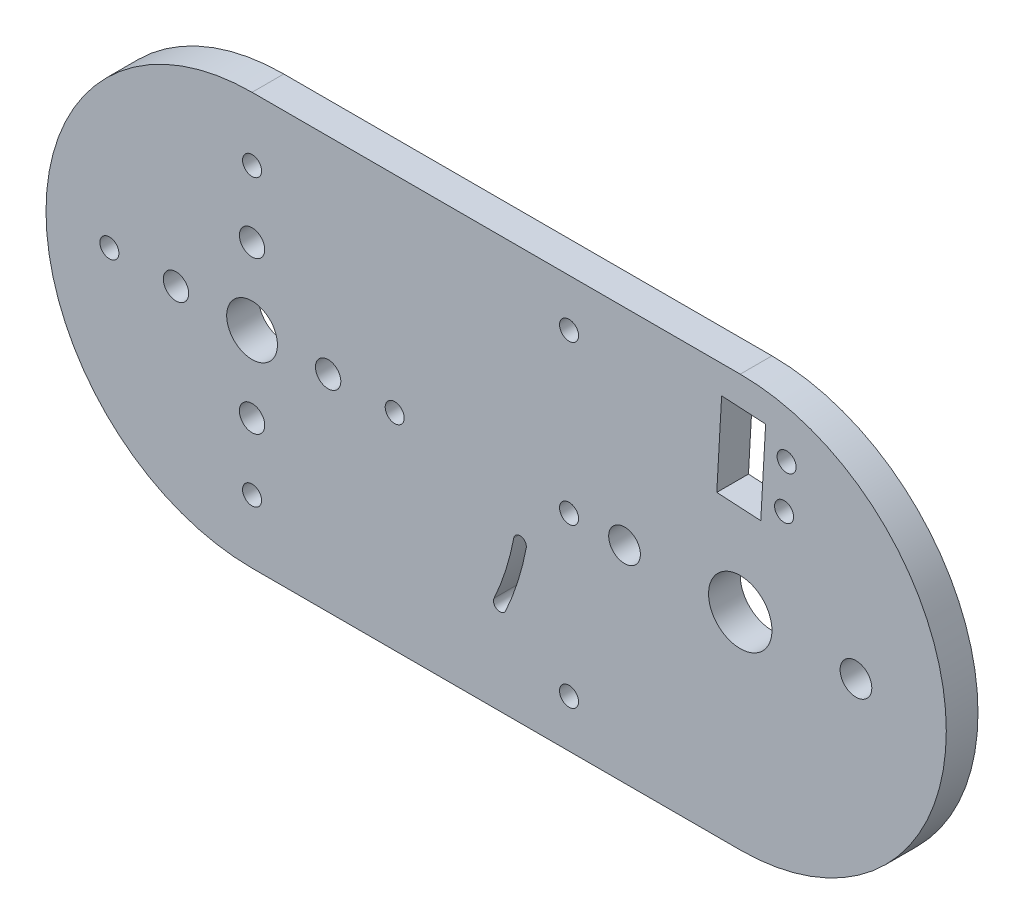
ISO-10303-21;
HEADER;
FILE_DESCRIPTION(('STEP AP214'),'2;1');
FILE_NAME('part.step','',(''),(''),'','','');
FILE_SCHEMA(('AUTOMOTIVE_DESIGN { 1 0 10303 214 1 1 1 1 }'));
ENDSEC;
DATA;
#1=APPLICATION_CONTEXT('core data for automotive mechanical design processes');
#2=APPLICATION_PROTOCOL_DEFINITION('international standard','automotive_design',2000,#1);
#3=PRODUCT_CONTEXT('',#1,'mechanical');
#4=PRODUCT('Part','Part','',(#3));
#5=PRODUCT_RELATED_PRODUCT_CATEGORY('part','',(#4));
#6=PRODUCT_DEFINITION_FORMATION('','',#4);
#7=PRODUCT_DEFINITION_CONTEXT('part definition',#1,'design');
#8=PRODUCT_DEFINITION('design','',#6,#7);
#9=PRODUCT_DEFINITION_SHAPE('','',#8);
#10=(LENGTH_UNIT() NAMED_UNIT(*) SI_UNIT(.MILLI.,.METRE.));
#11=(NAMED_UNIT(*) PLANE_ANGLE_UNIT() SI_UNIT($,.RADIAN.));
#12=(NAMED_UNIT(*) SI_UNIT($,.STERADIAN.) SOLID_ANGLE_UNIT());
#13=UNCERTAINTY_MEASURE_WITH_UNIT(LENGTH_MEASURE(1.E-05),#10,'distance_accuracy_value','');
#14=(GEOMETRIC_REPRESENTATION_CONTEXT(3) GLOBAL_UNCERTAINTY_ASSIGNED_CONTEXT((#13)) GLOBAL_UNIT_ASSIGNED_CONTEXT((#10,
#11,#12)) REPRESENTATION_CONTEXT('',''));
#15=CARTESIAN_POINT('',(0.,0.,0.));
#16=DIRECTION('',(0.,0.,1.));
#17=DIRECTION('',(1.,0.,0.));
#18=AXIS2_PLACEMENT_3D('',#15,#16,#17);
#19=CARTESIAN_POINT('',(-38.5,0.,5.));
#20=DIRECTION('',(0.,0.,1.));
#21=DIRECTION('',(1.,0.,0.));
#22=AXIS2_PLACEMENT_3D('',#19,#20,#21);
#23=PLANE('',#22);
#24=CARTESIAN_POINT('',(45.8113284801991,24.1895544692092,5.));
#25=DIRECTION('',(0.,0.,1.));
#26=DIRECTION('',(1.,0.,0.));
#27=AXIS2_PLACEMENT_3D('',#24,#25,#26);
#28=CIRCLE('',#27,1.5);
#29=CARTESIAN_POINT('',(47.3113284801991,24.1895544692092,5.));
#30=VERTEX_POINT('',#29);
#31=EDGE_CURVE('E195',#30,#30,#28,.T.);
#32=ORIENTED_EDGE('',*,*,#31,.F.);
#33=EDGE_LOOP('',(#32));
#34=FACE_BOUND('',#33,.T.);
#35=CARTESIAN_POINT('',(11.5,-25.,5.));
#36=DIRECTION('',(0.,0.,1.));
#37=DIRECTION('',(1.,0.,0.));
#38=AXIS2_PLACEMENT_3D('',#35,#36,#37);
#39=CIRCLE('',#38,1.5);
#40=CARTESIAN_POINT('',(13.,-25.,5.));
#41=VERTEX_POINT('',#40);
#42=EDGE_CURVE('E207',#41,#41,#39,.T.);
#43=ORIENTED_EDGE('',*,*,#42,.F.);
#44=EDGE_LOOP('',(#43));
#45=FACE_BOUND('',#44,.T.);
#46=CARTESIAN_POINT('',(-61.,0.,5.));
#47=DIRECTION('',(0.,0.,1.));
#48=DIRECTION('',(1.,0.,0.));
#49=AXIS2_PLACEMENT_3D('',#46,#47,#48);
#50=CIRCLE('',#49,1.5);
#51=CARTESIAN_POINT('',(-59.5,0.,5.));
#52=VERTEX_POINT('',#51);
#53=EDGE_CURVE('E219',#52,#52,#50,.T.);
#54=ORIENTED_EDGE('',*,*,#53,.F.);
#55=EDGE_LOOP('',(#54));
#56=FACE_BOUND('',#55,.T.);
#57=CARTESIAN_POINT('',(-16.,0.,5.));
#58=DIRECTION('',(0.,0.,1.));
#59=DIRECTION('',(1.,0.,0.));
#60=AXIS2_PLACEMENT_3D('',#57,#58,#59);
#61=CIRCLE('',#60,1.5);
#62=CARTESIAN_POINT('',(-14.5,0.,5.));
#63=VERTEX_POINT('',#62);
#64=EDGE_CURVE('E231',#63,#63,#61,.T.);
#65=ORIENTED_EDGE('',*,*,#64,.F.);
#66=EDGE_LOOP('',(#65));
#67=FACE_BOUND('',#66,.T.);
#68=CARTESIAN_POINT('',(-50.5,0.,5.));
#69=DIRECTION('',(0.,0.,1.));
#70=DIRECTION('',(1.,0.,0.));
#71=AXIS2_PLACEMENT_3D('',#68,#69,#70);
#72=CIRCLE('',#71,2.);
#73=CARTESIAN_POINT('',(-48.5,0.,5.));
#74=VERTEX_POINT('',#73);
#75=EDGE_CURVE('E243',#74,#74,#72,.T.);
#76=ORIENTED_EDGE('',*,*,#75,.F.);
#77=EDGE_LOOP('',(#76));
#78=FACE_BOUND('',#77,.T.);
#79=CARTESIAN_POINT('',(-26.5,0.,5.));
#80=DIRECTION('',(0.,0.,1.));
#81=DIRECTION('',(1.,0.,0.));
#82=AXIS2_PLACEMENT_3D('',#79,#80,#81);
#83=CIRCLE('',#82,2.);
#84=CARTESIAN_POINT('',(-24.5,0.,5.));
#85=VERTEX_POINT('',#84);
#86=EDGE_CURVE('E255',#85,#85,#83,.T.);
#87=ORIENTED_EDGE('',*,*,#86,.F.);
#88=EDGE_LOOP('',(#87));
#89=FACE_BOUND('',#88,.T.);
#90=CARTESIAN_POINT('',(56.75,0.,5.));
#91=DIRECTION('',(0.,0.,1.));
#92=DIRECTION('',(1.,0.,0.));
#93=AXIS2_PLACEMENT_3D('',#90,#91,#92);
#94=CIRCLE('',#93,2.5);
#95=CARTESIAN_POINT('',(59.25,0.,5.));
#96=VERTEX_POINT('',#95);
#97=EDGE_CURVE('E267',#96,#96,#94,.T.);
#98=ORIENTED_EDGE('',*,*,#97,.F.);
#99=EDGE_LOOP('',(#98));
#100=FACE_BOUND('',#99,.T.);
#101=CARTESIAN_POINT('',(38.5,0.,5.));
#102=DIRECTION('',(0.,0.,1.));
#103=DIRECTION('',(1.,0.,0.));
#104=AXIS2_PLACEMENT_3D('',#101,#102,#103);
#105=CIRCLE('',#104,5.);
#106=CARTESIAN_POINT('',(43.5,0.,5.));
#107=VERTEX_POINT('',#106);
#108=EDGE_CURVE('E279',#107,#107,#105,.T.);
#109=ORIENTED_EDGE('',*,*,#108,.F.);
#110=EDGE_LOOP('',(#109));
#111=FACE_BOUND('',#110,.T.);
#112=CARTESIAN_POINT('',(-38.5,0.,5.));
#113=DIRECTION('',(0.,0.,1.));
#114=DIRECTION('',(1.,0.,0.));
#115=AXIS2_PLACEMENT_3D('',#112,#113,#114);
#116=CIRCLE('',#115,32.5);
#117=CARTESIAN_POINT('',(-38.5,32.5,5.));
#118=VERTEX_POINT('',#117);
#119=CARTESIAN_POINT('',(-38.5,-32.5,5.));
#120=VERTEX_POINT('',#119);
#121=EDGE_CURVE('E291',#118,#120,#116,.T.);
#122=ORIENTED_EDGE('',*,*,#121,.T.);
#123=DIRECTION('',(1.,0.,0.));
#124=VECTOR('',#123,1.);
#125=CARTESIAN_POINT('',(-38.5,-32.5,5.));
#126=LINE('',#125,#124);
#127=CARTESIAN_POINT('',(38.5,-32.5,5.));
#128=VERTEX_POINT('',#127);
#129=EDGE_CURVE('E294',#120,#128,#126,.T.);
#130=ORIENTED_EDGE('',*,*,#129,.T.);
#131=CARTESIAN_POINT('',(38.5,0.,5.));
#132=DIRECTION('',(0.,0.,1.));
#133=DIRECTION('',(1.,0.,0.));
#134=AXIS2_PLACEMENT_3D('',#131,#132,#133);
#135=CIRCLE('',#134,32.5);
#136=CARTESIAN_POINT('',(38.5,32.5,5.));
#137=VERTEX_POINT('',#136);
#138=EDGE_CURVE('E297',#128,#137,#135,.T.);
#139=ORIENTED_EDGE('',*,*,#138,.T.);
#140=DIRECTION('',(-1.,0.,0.));
#141=VECTOR('',#140,1.);
#142=CARTESIAN_POINT('',(-38.5,32.5,5.));
#143=LINE('',#142,#141);
#144=EDGE_CURVE('E299',#137,#118,#143,.T.);
#145=ORIENTED_EDGE('',*,*,#144,.T.);
#146=EDGE_LOOP('',(#122,#130,#139,#145));
#147=FACE_BOUND('',#146,.T.);
#148=CARTESIAN_POINT('',(-38.5,0.,5.));
#149=DIRECTION('',(0.,0.,1.));
#150=DIRECTION('',(1.,0.,0.));
#151=AXIS2_PLACEMENT_3D('',#148,#149,#150);
#152=CIRCLE('',#151,4.);
#153=CARTESIAN_POINT('',(-34.5,0.,5.));
#154=VERTEX_POINT('',#153);
#155=EDGE_CURVE('E285',#154,#154,#152,.T.);
#156=ORIENTED_EDGE('',*,*,#155,.F.);
#157=EDGE_LOOP('',(#156));
#158=FACE_BOUND('',#157,.T.);
#159=CARTESIAN_POINT('',(20.25,0.,5.));
#160=DIRECTION('',(0.,0.,1.));
#161=DIRECTION('',(1.,0.,0.));
#162=AXIS2_PLACEMENT_3D('',#159,#160,#161);
#163=CIRCLE('',#162,2.5);
#164=CARTESIAN_POINT('',(22.75,0.,5.));
#165=VERTEX_POINT('',#164);
#166=EDGE_CURVE('E273',#165,#165,#163,.T.);
#167=ORIENTED_EDGE('',*,*,#166,.F.);
#168=EDGE_LOOP('',(#167));
#169=FACE_BOUND('',#168,.T.);
#170=CARTESIAN_POINT('',(-38.5,-12.,5.));
#171=DIRECTION('',(0.,0.,1.));
#172=DIRECTION('',(1.,0.,0.));
#173=AXIS2_PLACEMENT_3D('',#170,#171,#172);
#174=CIRCLE('',#173,2.);
#175=CARTESIAN_POINT('',(-36.5,-12.,5.));
#176=VERTEX_POINT('',#175);
#177=EDGE_CURVE('E261',#176,#176,#174,.T.);
#178=ORIENTED_EDGE('',*,*,#177,.F.);
#179=EDGE_LOOP('',(#178));
#180=FACE_BOUND('',#179,.T.);
#181=CARTESIAN_POINT('',(-38.5,12.,5.));
#182=DIRECTION('',(0.,0.,1.));
#183=DIRECTION('',(1.,0.,0.));
#184=AXIS2_PLACEMENT_3D('',#181,#182,#183);
#185=CIRCLE('',#184,2.);
#186=CARTESIAN_POINT('',(-36.5,12.,5.));
#187=VERTEX_POINT('',#186);
#188=EDGE_CURVE('E249',#187,#187,#185,.T.);
#189=ORIENTED_EDGE('',*,*,#188,.F.);
#190=EDGE_LOOP('',(#189));
#191=FACE_BOUND('',#190,.T.);
#192=CARTESIAN_POINT('',(-38.5,22.5,5.));
#193=DIRECTION('',(0.,0.,1.));
#194=DIRECTION('',(1.,0.,0.));
#195=AXIS2_PLACEMENT_3D('',#192,#193,#194);
#196=CIRCLE('',#195,1.5);
#197=CARTESIAN_POINT('',(-37.,22.5,5.));
#198=VERTEX_POINT('',#197);
#199=EDGE_CURVE('E237',#198,#198,#196,.T.);
#200=ORIENTED_EDGE('',*,*,#199,.F.);
#201=EDGE_LOOP('',(#200));
#202=FACE_BOUND('',#201,.T.);
#203=CARTESIAN_POINT('',(-38.5,-22.5,5.));
#204=DIRECTION('',(0.,0.,1.));
#205=DIRECTION('',(1.,0.,0.));
#206=AXIS2_PLACEMENT_3D('',#203,#204,#205);
#207=CIRCLE('',#206,1.5);
#208=CARTESIAN_POINT('',(-37.,-22.5,5.));
#209=VERTEX_POINT('',#208);
#210=EDGE_CURVE('E225',#209,#209,#207,.T.);
#211=ORIENTED_EDGE('',*,*,#210,.F.);
#212=EDGE_LOOP('',(#211));
#213=FACE_BOUND('',#212,.T.);
#214=CARTESIAN_POINT('',(11.5,0.,5.));
#215=DIRECTION('',(0.,0.,1.));
#216=DIRECTION('',(1.,0.,0.));
#217=AXIS2_PLACEMENT_3D('',#214,#215,#216);
#218=CIRCLE('',#217,1.5);
#219=CARTESIAN_POINT('',(13.,0.,5.));
#220=VERTEX_POINT('',#219);
#221=EDGE_CURVE('E213',#220,#220,#218,.T.);
#222=ORIENTED_EDGE('',*,*,#221,.F.);
#223=EDGE_LOOP('',(#222));
#224=FACE_BOUND('',#223,.T.);
#225=CARTESIAN_POINT('',(11.5,25.,5.));
#226=DIRECTION('',(0.,0.,1.));
#227=DIRECTION('',(1.,0.,0.));
#228=AXIS2_PLACEMENT_3D('',#225,#226,#227);
#229=CIRCLE('',#228,1.5);
#230=CARTESIAN_POINT('',(13.,25.,5.));
#231=VERTEX_POINT('',#230);
#232=EDGE_CURVE('E201',#231,#231,#229,.T.);
#233=ORIENTED_EDGE('',*,*,#232,.F.);
#234=EDGE_LOOP('',(#233));
#235=FACE_BOUND('',#234,.T.);
#236=CARTESIAN_POINT('',(45.4163894157242,17.2007045534027,5.));
#237=DIRECTION('',(0.,0.,1.));
#238=DIRECTION('',(1.,0.,0.));
#239=AXIS2_PLACEMENT_3D('',#236,#237,#238);
#240=CIRCLE('',#239,1.49999999999999);
#241=CARTESIAN_POINT('',(46.9163894157242,17.2007045534027,5.));
#242=VERTEX_POINT('',#241);
#243=EDGE_CURVE('E189',#242,#242,#240,.T.);
#244=ORIENTED_EDGE('',*,*,#243,.F.);
#245=EDGE_LOOP('',(#244));
#246=FACE_BOUND('',#245,.T.);
#247=CARTESIAN_POINT('',(0.588763908782562,-17.9183854206638,5.));
#248=DIRECTION('',(0.,0.,1.));
#249=DIRECTION('',(1.,0.,0.));
#250=AXIS2_PLACEMENT_3D('',#247,#248,#249);
#251=CIRCLE('',#250,1.);
#252=CARTESIAN_POINT('',(-0.320277112354612,-17.5016787829798,5.));
#253=VERTEX_POINT('',#252);
#254=CARTESIAN_POINT('',(1.49780492991973,-18.3350920583478,5.));
#255=VERTEX_POINT('',#254);
#256=EDGE_CURVE('E160',#253,#255,#251,.T.);
#257=ORIENTED_EDGE('',*,*,#256,.F.);
#258=CARTESIAN_POINT('',(-38.5,0.,5.));
#259=DIRECTION('',(0.,0.,-1.));
#260=DIRECTION('',(1.,0.,0.));
#261=AXIS2_PLACEMENT_3D('',#258,#259,#260);
#262=CIRCLE('',#261,42.);
#263=CARTESIAN_POINT('',(2.78021392533827,-7.74234707813517,5.));
#264=VERTEX_POINT('',#263);
#265=EDGE_CURVE('E158',#264,#253,#262,.T.);
#266=ORIENTED_EDGE('',*,*,#265,.F.);
#267=CARTESIAN_POINT('',(3.76307616165431,-7.92668867524178,5.));
#268=DIRECTION('',(0.,0.,1.));
#269=DIRECTION('',(-1.,0.,0.));
#270=AXIS2_PLACEMENT_3D('',#267,#268,#269);
#271=CIRCLE('',#270,0.999999999999996);
#272=CARTESIAN_POINT('',(4.74593839797185,-8.11103027234043,5.));
#273=VERTEX_POINT('',#272);
#274=EDGE_CURVE('E166',#273,#264,#271,.T.);
#275=ORIENTED_EDGE('',*,*,#274,.F.);
#276=CARTESIAN_POINT('',(-38.5,0.,5.));
#277=DIRECTION('',(0.,0.,1.));
#278=DIRECTION('',(1.,0.,0.));
#279=AXIS2_PLACEMENT_3D('',#276,#277,#278);
#280=CIRCLE('',#279,44.);
#281=EDGE_CURVE('E163',#255,#273,#280,.T.);
#282=ORIENTED_EDGE('',*,*,#281,.F.);
#283=EDGE_LOOP('',(#257,#266,#275,#282));
#284=FACE_BOUND('',#283,.T.);
#285=DIRECTION('',(0.0564198663476302,0.998407130724393,0.));
#286=VECTOR('',#285,1.);
#287=CARTESIAN_POINT('',(42.5030890815902,27.6817675324485,5.));
#288=LINE('',#287,#286);
#289=CARTESIAN_POINT('',(41.7357788992624,14.1034305545968,5.));
#290=VERTEX_POINT('',#289);
#291=CARTESIAN_POINT('',(42.5030890815902,27.6817675324485,5.));
#292=VERTEX_POINT('',#291);
#293=EDGE_CURVE('E130',#290,#292,#288,.T.);
#294=ORIENTED_EDGE('',*,*,#293,.F.);
#295=DIRECTION('',(0.998407130724393,-0.05641986634763,0.));
#296=VECTOR('',#295,1.);
#297=CARTESIAN_POINT('',(34.7968493407279,14.4955486257128,5.));
#298=LINE('',#297,#296);
#299=CARTESIAN_POINT('',(34.7968493407279,14.4955486257128,5.));
#300=VERTEX_POINT('',#299);
#301=EDGE_CURVE('E122',#300,#290,#298,.T.);
#302=ORIENTED_EDGE('',*,*,#301,.F.);
#303=DIRECTION('',(-0.0564198663476302,-0.998407130724393,0.));
#304=VECTOR('',#303,1.);
#305=CARTESIAN_POINT('',(35.5641595230556,28.0738856035646,5.));
#306=LINE('',#305,#304);
#307=CARTESIAN_POINT('',(35.5641595230556,28.0738856035646,5.));
#308=VERTEX_POINT('',#307);
#309=EDGE_CURVE('E144',#308,#300,#306,.T.);
#310=ORIENTED_EDGE('',*,*,#309,.F.);
#311=DIRECTION('',(-0.998407130724393,0.0564198663476302,0.));
#312=VECTOR('',#311,1.);
#313=CARTESIAN_POINT('',(42.5030890815902,27.6817675324485,5.));
#314=LINE('',#313,#312);
#315=EDGE_CURVE('E142',#292,#308,#314,.T.);
#316=ORIENTED_EDGE('',*,*,#315,.F.);
#317=EDGE_LOOP('',(#294,#302,#310,#316));
#318=FACE_BOUND('',#317,.T.);
#319=ADVANCED_FACE('F33',(#34,#45,#56,#67,#78,#89,#100,#111,#147,#158,#169,#180,#191,#202,#213,
#224,#235,#246,#284,#318),#23,.T.);
#320=CARTESIAN_POINT('',(-38.5,0.,0.));
#321=DIRECTION('',(0.,0.,1.));
#322=DIRECTION('',(1.,0.,0.));
#323=AXIS2_PLACEMENT_3D('',#320,#321,#322);
#324=PLANE('',#323);
#325=CARTESIAN_POINT('',(-38.5,0.,0.));
#326=DIRECTION('',(0.,0.,-1.));
#327=DIRECTION('',(1.,0.,0.));
#328=AXIS2_PLACEMENT_3D('',#325,#326,#327);
#329=CIRCLE('',#328,42.);
#330=CARTESIAN_POINT('',(2.78021392533827,-7.74234707813517,0.));
#331=VERTEX_POINT('',#330);
#332=CARTESIAN_POINT('',(-0.320277112354612,-17.5016787829798,0.));
#333=VERTEX_POINT('',#332);
#334=EDGE_CURVE('E138',#331,#333,#329,.T.);
#335=ORIENTED_EDGE('',*,*,#334,.T.);
#336=CARTESIAN_POINT('',(0.588763908782562,-17.9183854206638,0.));
#337=DIRECTION('',(0.,0.,1.));
#338=DIRECTION('',(1.,0.,0.));
#339=AXIS2_PLACEMENT_3D('',#336,#337,#338);
#340=CIRCLE('',#339,1.);
#341=CARTESIAN_POINT('',(1.49780492991973,-18.3350920583478,0.));
#342=VERTEX_POINT('',#341);
#343=EDGE_CURVE('E171',#333,#342,#340,.T.);
#344=ORIENTED_EDGE('',*,*,#343,.T.);
#345=CARTESIAN_POINT('',(-38.5,0.,0.));
#346=DIRECTION('',(0.,0.,1.));
#347=DIRECTION('',(1.,0.,0.));
#348=AXIS2_PLACEMENT_3D('',#345,#346,#347);
#349=CIRCLE('',#348,44.);
#350=CARTESIAN_POINT('',(4.74593839797186,-8.11103027234043,0.));
#351=VERTEX_POINT('',#350);
#352=EDGE_CURVE('E174',#342,#351,#349,.T.);
#353=ORIENTED_EDGE('',*,*,#352,.T.);
#354=CARTESIAN_POINT('',(3.76307616165431,-7.92668867524178,0.));
#355=DIRECTION('',(0.,0.,1.));
#356=DIRECTION('',(-1.,0.,0.));
#357=AXIS2_PLACEMENT_3D('',#354,#355,#356);
#358=CIRCLE('',#357,0.999999999999996);
#359=EDGE_CURVE('E161',#351,#331,#358,.T.);
#360=ORIENTED_EDGE('',*,*,#359,.T.);
#361=EDGE_LOOP('',(#335,#344,#353,#360));
#362=FACE_BOUND('',#361,.T.);
#363=CARTESIAN_POINT('',(-38.5,0.,0.));
#364=DIRECTION('',(0.,0.,1.));
#365=DIRECTION('',(1.,0.,0.));
#366=AXIS2_PLACEMENT_3D('',#363,#364,#365);
#367=CIRCLE('',#366,32.5);
#368=CARTESIAN_POINT('',(-38.5,32.5,0.));
#369=VERTEX_POINT('',#368);
#370=CARTESIAN_POINT('',(-38.5,-32.5,0.));
#371=VERTEX_POINT('',#370);
#372=EDGE_CURVE('E288',#369,#371,#367,.T.);
#373=ORIENTED_EDGE('',*,*,#372,.F.);
#374=DIRECTION('',(-1.,0.,0.));
#375=VECTOR('',#374,1.);
#376=CARTESIAN_POINT('',(-38.5,32.5,0.));
#377=LINE('',#376,#375);
#378=CARTESIAN_POINT('',(38.5,32.5,0.));
#379=VERTEX_POINT('',#378);
#380=EDGE_CURVE('E295',#379,#369,#377,.T.);
#381=ORIENTED_EDGE('',*,*,#380,.F.);
#382=CARTESIAN_POINT('',(38.5,0.,0.));
#383=DIRECTION('',(0.,0.,1.));
#384=DIRECTION('',(1.,0.,0.));
#385=AXIS2_PLACEMENT_3D('',#382,#383,#384);
#386=CIRCLE('',#385,32.5);
#387=CARTESIAN_POINT('',(38.5,-32.5,0.));
#388=VERTEX_POINT('',#387);
#389=EDGE_CURVE('E306',#388,#379,#386,.T.);
#390=ORIENTED_EDGE('',*,*,#389,.F.);
#391=DIRECTION('',(1.,0.,0.));
#392=VECTOR('',#391,1.);
#393=CARTESIAN_POINT('',(-38.5,-32.5,0.));
#394=LINE('',#393,#392);
#395=EDGE_CURVE('E304',#371,#388,#394,.T.);
#396=ORIENTED_EDGE('',*,*,#395,.F.);
#397=EDGE_LOOP('',(#373,#381,#390,#396));
#398=FACE_BOUND('',#397,.T.);
#399=CARTESIAN_POINT('',(-38.5,0.,0.));
#400=DIRECTION('',(0.,0.,1.));
#401=DIRECTION('',(1.,0.,0.));
#402=AXIS2_PLACEMENT_3D('',#399,#400,#401);
#403=CIRCLE('',#402,4.);
#404=CARTESIAN_POINT('',(-34.5,0.,0.));
#405=VERTEX_POINT('',#404);
#406=EDGE_CURVE('E282',#405,#405,#403,.T.);
#407=ORIENTED_EDGE('',*,*,#406,.T.);
#408=EDGE_LOOP('',(#407));
#409=FACE_BOUND('',#408,.T.);
#410=CARTESIAN_POINT('',(38.5,0.,0.));
#411=DIRECTION('',(0.,0.,1.));
#412=DIRECTION('',(1.,0.,0.));
#413=AXIS2_PLACEMENT_3D('',#410,#411,#412);
#414=CIRCLE('',#413,5.);
#415=CARTESIAN_POINT('',(43.5,0.,0.));
#416=VERTEX_POINT('',#415);
#417=EDGE_CURVE('E276',#416,#416,#414,.T.);
#418=ORIENTED_EDGE('',*,*,#417,.T.);
#419=EDGE_LOOP('',(#418));
#420=FACE_BOUND('',#419,.T.);
#421=CARTESIAN_POINT('',(20.25,0.,0.));
#422=DIRECTION('',(0.,0.,1.));
#423=DIRECTION('',(1.,0.,0.));
#424=AXIS2_PLACEMENT_3D('',#421,#422,#423);
#425=CIRCLE('',#424,2.5);
#426=CARTESIAN_POINT('',(22.75,0.,0.));
#427=VERTEX_POINT('',#426);
#428=EDGE_CURVE('E270',#427,#427,#425,.T.);
#429=ORIENTED_EDGE('',*,*,#428,.T.);
#430=EDGE_LOOP('',(#429));
#431=FACE_BOUND('',#430,.T.);
#432=CARTESIAN_POINT('',(56.75,0.,0.));
#433=DIRECTION('',(0.,0.,1.));
#434=DIRECTION('',(1.,0.,0.));
#435=AXIS2_PLACEMENT_3D('',#432,#433,#434);
#436=CIRCLE('',#435,2.5);
#437=CARTESIAN_POINT('',(59.25,0.,0.));
#438=VERTEX_POINT('',#437);
#439=EDGE_CURVE('E264',#438,#438,#436,.T.);
#440=ORIENTED_EDGE('',*,*,#439,.T.);
#441=EDGE_LOOP('',(#440));
#442=FACE_BOUND('',#441,.T.);
#443=CARTESIAN_POINT('',(-38.5,-12.,0.));
#444=DIRECTION('',(0.,0.,1.));
#445=DIRECTION('',(1.,0.,0.));
#446=AXIS2_PLACEMENT_3D('',#443,#444,#445);
#447=CIRCLE('',#446,2.);
#448=CARTESIAN_POINT('',(-36.5,-12.,0.));
#449=VERTEX_POINT('',#448);
#450=EDGE_CURVE('E258',#449,#449,#447,.T.);
#451=ORIENTED_EDGE('',*,*,#450,.T.);
#452=EDGE_LOOP('',(#451));
#453=FACE_BOUND('',#452,.T.);
#454=CARTESIAN_POINT('',(-26.5,0.,0.));
#455=DIRECTION('',(0.,0.,1.));
#456=DIRECTION('',(1.,0.,0.));
#457=AXIS2_PLACEMENT_3D('',#454,#455,#456);
#458=CIRCLE('',#457,2.);
#459=CARTESIAN_POINT('',(-24.5,0.,0.));
#460=VERTEX_POINT('',#459);
#461=EDGE_CURVE('E252',#460,#460,#458,.T.);
#462=ORIENTED_EDGE('',*,*,#461,.T.);
#463=EDGE_LOOP('',(#462));
#464=FACE_BOUND('',#463,.T.);
#465=CARTESIAN_POINT('',(-38.5,12.,0.));
#466=DIRECTION('',(0.,0.,1.));
#467=DIRECTION('',(1.,0.,0.));
#468=AXIS2_PLACEMENT_3D('',#465,#466,#467);
#469=CIRCLE('',#468,2.);
#470=CARTESIAN_POINT('',(-36.5,12.,0.));
#471=VERTEX_POINT('',#470);
#472=EDGE_CURVE('E246',#471,#471,#469,.T.);
#473=ORIENTED_EDGE('',*,*,#472,.T.);
#474=EDGE_LOOP('',(#473));
#475=FACE_BOUND('',#474,.T.);
#476=CARTESIAN_POINT('',(-50.5,0.,0.));
#477=DIRECTION('',(0.,0.,1.));
#478=DIRECTION('',(1.,0.,0.));
#479=AXIS2_PLACEMENT_3D('',#476,#477,#478);
#480=CIRCLE('',#479,2.);
#481=CARTESIAN_POINT('',(-48.5,0.,0.));
#482=VERTEX_POINT('',#481);
#483=EDGE_CURVE('E240',#482,#482,#480,.T.);
#484=ORIENTED_EDGE('',*,*,#483,.T.);
#485=EDGE_LOOP('',(#484));
#486=FACE_BOUND('',#485,.T.);
#487=CARTESIAN_POINT('',(-38.5,22.5,0.));
#488=DIRECTION('',(0.,0.,1.));
#489=DIRECTION('',(1.,0.,0.));
#490=AXIS2_PLACEMENT_3D('',#487,#488,#489);
#491=CIRCLE('',#490,1.5);
#492=CARTESIAN_POINT('',(-37.,22.5,0.));
#493=VERTEX_POINT('',#492);
#494=EDGE_CURVE('E234',#493,#493,#491,.T.);
#495=ORIENTED_EDGE('',*,*,#494,.T.);
#496=EDGE_LOOP('',(#495));
#497=FACE_BOUND('',#496,.T.);
#498=CARTESIAN_POINT('',(-16.,0.,0.));
#499=DIRECTION('',(0.,0.,1.));
#500=DIRECTION('',(1.,0.,0.));
#501=AXIS2_PLACEMENT_3D('',#498,#499,#500);
#502=CIRCLE('',#501,1.5);
#503=CARTESIAN_POINT('',(-14.5,0.,0.));
#504=VERTEX_POINT('',#503);
#505=EDGE_CURVE('E228',#504,#504,#502,.T.);
#506=ORIENTED_EDGE('',*,*,#505,.T.);
#507=EDGE_LOOP('',(#506));
#508=FACE_BOUND('',#507,.T.);
#509=CARTESIAN_POINT('',(-38.5,-22.5,0.));
#510=DIRECTION('',(0.,0.,1.));
#511=DIRECTION('',(1.,0.,0.));
#512=AXIS2_PLACEMENT_3D('',#509,#510,#511);
#513=CIRCLE('',#512,1.5);
#514=CARTESIAN_POINT('',(-37.,-22.5,0.));
#515=VERTEX_POINT('',#514);
#516=EDGE_CURVE('E222',#515,#515,#513,.T.);
#517=ORIENTED_EDGE('',*,*,#516,.T.);
#518=EDGE_LOOP('',(#517));
#519=FACE_BOUND('',#518,.T.);
#520=CARTESIAN_POINT('',(-61.,0.,0.));
#521=DIRECTION('',(0.,0.,1.));
#522=DIRECTION('',(1.,0.,0.));
#523=AXIS2_PLACEMENT_3D('',#520,#521,#522);
#524=CIRCLE('',#523,1.5);
#525=CARTESIAN_POINT('',(-59.5,0.,0.));
#526=VERTEX_POINT('',#525);
#527=EDGE_CURVE('E216',#526,#526,#524,.T.);
#528=ORIENTED_EDGE('',*,*,#527,.T.);
#529=EDGE_LOOP('',(#528));
#530=FACE_BOUND('',#529,.T.);
#531=CARTESIAN_POINT('',(11.5,0.,0.));
#532=DIRECTION('',(0.,0.,1.));
#533=DIRECTION('',(1.,0.,0.));
#534=AXIS2_PLACEMENT_3D('',#531,#532,#533);
#535=CIRCLE('',#534,1.5);
#536=CARTESIAN_POINT('',(13.,0.,0.));
#537=VERTEX_POINT('',#536);
#538=EDGE_CURVE('E210',#537,#537,#535,.T.);
#539=ORIENTED_EDGE('',*,*,#538,.T.);
#540=EDGE_LOOP('',(#539));
#541=FACE_BOUND('',#540,.T.);
#542=CARTESIAN_POINT('',(11.5,-25.,0.));
#543=DIRECTION('',(0.,0.,1.));
#544=DIRECTION('',(1.,0.,0.));
#545=AXIS2_PLACEMENT_3D('',#542,#543,#544);
#546=CIRCLE('',#545,1.5);
#547=CARTESIAN_POINT('',(13.,-25.,0.));
#548=VERTEX_POINT('',#547);
#549=EDGE_CURVE('E204',#548,#548,#546,.T.);
#550=ORIENTED_EDGE('',*,*,#549,.T.);
#551=EDGE_LOOP('',(#550));
#552=FACE_BOUND('',#551,.T.);
#553=CARTESIAN_POINT('',(11.5,25.,0.));
#554=DIRECTION('',(0.,0.,1.));
#555=DIRECTION('',(1.,0.,0.));
#556=AXIS2_PLACEMENT_3D('',#553,#554,#555);
#557=CIRCLE('',#556,1.5);
#558=CARTESIAN_POINT('',(13.,25.,0.));
#559=VERTEX_POINT('',#558);
#560=EDGE_CURVE('E198',#559,#559,#557,.T.);
#561=ORIENTED_EDGE('',*,*,#560,.T.);
#562=EDGE_LOOP('',(#561));
#563=FACE_BOUND('',#562,.T.);
#564=CARTESIAN_POINT('',(45.8113284801991,24.1895544692092,0.));
#565=DIRECTION('',(0.,0.,1.));
#566=DIRECTION('',(1.,0.,0.));
#567=AXIS2_PLACEMENT_3D('',#564,#565,#566);
#568=CIRCLE('',#567,1.5);
#569=CARTESIAN_POINT('',(47.3113284801991,24.1895544692092,0.));
#570=VERTEX_POINT('',#569);
#571=EDGE_CURVE('E192',#570,#570,#568,.T.);
#572=ORIENTED_EDGE('',*,*,#571,.T.);
#573=EDGE_LOOP('',(#572));
#574=FACE_BOUND('',#573,.T.);
#575=CARTESIAN_POINT('',(45.4163894157242,17.2007045534027,0.));
#576=DIRECTION('',(0.,0.,1.));
#577=DIRECTION('',(1.,0.,0.));
#578=AXIS2_PLACEMENT_3D('',#575,#576,#577);
#579=CIRCLE('',#578,1.49999999999999);
#580=CARTESIAN_POINT('',(46.9163894157242,17.2007045534027,0.));
#581=VERTEX_POINT('',#580);
#582=EDGE_CURVE('E188',#581,#581,#579,.T.);
#583=ORIENTED_EDGE('',*,*,#582,.T.);
#584=EDGE_LOOP('',(#583));
#585=FACE_BOUND('',#584,.T.);
#586=DIRECTION('',(0.998407130724393,-0.05641986634763,0.));
#587=VECTOR('',#586,1.);
#588=CARTESIAN_POINT('',(34.7968493407279,14.4955486257128,0.));
#589=LINE('',#588,#587);
#590=CARTESIAN_POINT('',(34.7968493407278,14.4955486257128,0.));
#591=VERTEX_POINT('',#590);
#592=CARTESIAN_POINT('',(41.7357788992624,14.1034305545968,0.));
#593=VERTEX_POINT('',#592);
#594=EDGE_CURVE('E56',#591,#593,#589,.T.);
#595=ORIENTED_EDGE('',*,*,#594,.T.);
#596=DIRECTION('',(0.0564198663476302,0.998407130724393,0.));
#597=VECTOR('',#596,1.);
#598=CARTESIAN_POINT('',(42.5030890815902,27.6817675324485,0.));
#599=LINE('',#598,#597);
#600=CARTESIAN_POINT('',(42.5030890815902,27.6817675324485,0.));
#601=VERTEX_POINT('',#600);
#602=EDGE_CURVE('E137',#593,#601,#599,.T.);
#603=ORIENTED_EDGE('',*,*,#602,.T.);
#604=DIRECTION('',(-0.998407130724393,0.0564198663476302,0.));
#605=VECTOR('',#604,1.);
#606=CARTESIAN_POINT('',(42.5030890815902,27.6817675324485,0.));
#607=LINE('',#606,#605);
#608=CARTESIAN_POINT('',(35.5641595230556,28.0738856035646,0.));
#609=VERTEX_POINT('',#608);
#610=EDGE_CURVE('E150',#601,#609,#607,.T.);
#611=ORIENTED_EDGE('',*,*,#610,.T.);
#612=DIRECTION('',(-0.0564198663476302,-0.998407130724393,0.));
#613=VECTOR('',#612,1.);
#614=CARTESIAN_POINT('',(35.5641595230556,28.0738856035646,0.));
#615=LINE('',#614,#613);
#616=EDGE_CURVE('E131',#609,#591,#615,.T.);
#617=ORIENTED_EDGE('',*,*,#616,.T.);
#618=EDGE_LOOP('',(#595,#603,#611,#617));
#619=FACE_BOUND('',#618,.T.);
#620=ADVANCED_FACE('F324',(#362,#398,#409,#420,#431,#442,#453,#464,#475,#486,#497,#508,#519,
#530,#541,#552,#563,#574,#585,#619),#324,.F.);
#621=CARTESIAN_POINT('',(-38.5,0.,5.));
#622=DIRECTION('',(0.,0.,-1.));
#623=DIRECTION('',(-1.,0.,0.));
#624=AXIS2_PLACEMENT_3D('',#621,#622,#623);
#625=CYLINDRICAL_SURFACE('',#624,32.5);
#626=ORIENTED_EDGE('',*,*,#372,.T.);
#627=DIRECTION('',(0.,0.,-1.));
#628=VECTOR('',#627,1.);
#629=CARTESIAN_POINT('',(-38.5,-32.5,5.));
#630=LINE('',#629,#628);
#631=EDGE_CURVE('E11',#120,#371,#630,.T.);
#632=ORIENTED_EDGE('',*,*,#631,.F.);
#633=ORIENTED_EDGE('',*,*,#121,.F.);
#634=DIRECTION('',(0.,0.,-1.));
#635=VECTOR('',#634,1.);
#636=CARTESIAN_POINT('',(-38.5,32.5,5.));
#637=LINE('',#636,#635);
#638=EDGE_CURVE('E301',#118,#369,#637,.T.);
#639=ORIENTED_EDGE('',*,*,#638,.T.);
#640=EDGE_LOOP('',(#626,#632,#633,#639));
#641=FACE_BOUND('',#640,.T.);
#642=ADVANCED_FACE('F35',(#641),#625,.T.);
#643=CARTESIAN_POINT('',(-38.5,-32.5,5.));
#644=DIRECTION('',(0.,1.,0.));
#645=DIRECTION('',(0.,0.,1.));
#646=AXIS2_PLACEMENT_3D('',#643,#644,#645);
#647=PLANE('',#646);
#648=ORIENTED_EDGE('',*,*,#395,.T.);
#649=DIRECTION('',(0.,0.,-1.));
#650=VECTOR('',#649,1.);
#651=CARTESIAN_POINT('',(38.5,-32.5,5.));
#652=LINE('',#651,#650);
#653=EDGE_CURVE('E41',#128,#388,#652,.T.);
#654=ORIENTED_EDGE('',*,*,#653,.F.);
#655=ORIENTED_EDGE('',*,*,#129,.F.);
#656=ORIENTED_EDGE('',*,*,#631,.T.);
#657=EDGE_LOOP('',(#648,#654,#655,#656));
#658=FACE_BOUND('',#657,.T.);
#659=ADVANCED_FACE('F335',(#658),#647,.F.);
#660=CARTESIAN_POINT('',(38.5,0.,5.));
#661=DIRECTION('',(0.,0.,-1.));
#662=DIRECTION('',(-1.,0.,0.));
#663=AXIS2_PLACEMENT_3D('',#660,#661,#662);
#664=CYLINDRICAL_SURFACE('',#663,32.5);
#665=ORIENTED_EDGE('',*,*,#389,.T.);
#666=DIRECTION('',(0.,0.,-1.));
#667=VECTOR('',#666,1.);
#668=CARTESIAN_POINT('',(38.5,32.5,5.));
#669=LINE('',#668,#667);
#670=EDGE_CURVE('E311',#137,#379,#669,.T.);
#671=ORIENTED_EDGE('',*,*,#670,.F.);
#672=ORIENTED_EDGE('',*,*,#138,.F.);
#673=ORIENTED_EDGE('',*,*,#653,.T.);
#674=EDGE_LOOP('',(#665,#671,#672,#673));
#675=FACE_BOUND('',#674,.T.);
#676=ADVANCED_FACE('F318',(#675),#664,.T.);
#677=CARTESIAN_POINT('',(-38.5,32.5,5.));
#678=DIRECTION('',(0.,-1.,0.));
#679=DIRECTION('',(0.,0.,-1.));
#680=AXIS2_PLACEMENT_3D('',#677,#678,#679);
#681=PLANE('',#680);
#682=ORIENTED_EDGE('',*,*,#380,.T.);
#683=ORIENTED_EDGE('',*,*,#638,.F.);
#684=ORIENTED_EDGE('',*,*,#144,.F.);
#685=ORIENTED_EDGE('',*,*,#670,.T.);
#686=EDGE_LOOP('',(#682,#683,#684,#685));
#687=FACE_BOUND('',#686,.T.);
#688=ADVANCED_FACE('F328',(#687),#681,.F.);
#689=CARTESIAN_POINT('',(-38.5,0.,5.));
#690=DIRECTION('',(0.,0.,-1.));
#691=DIRECTION('',(-1.,0.,0.));
#692=AXIS2_PLACEMENT_3D('',#689,#690,#691);
#693=CYLINDRICAL_SURFACE('',#692,4.);
#694=ORIENTED_EDGE('',*,*,#155,.T.);
#695=EDGE_LOOP('',(#694));
#696=FACE_BOUND('',#695,.T.);
#697=ORIENTED_EDGE('',*,*,#406,.F.);
#698=EDGE_LOOP('',(#697));
#699=FACE_BOUND('',#698,.T.);
#700=ADVANCED_FACE('F353',(#696,#699),#693,.F.);
#701=CARTESIAN_POINT('',(38.5,0.,5.));
#702=DIRECTION('',(0.,0.,-1.));
#703=DIRECTION('',(-1.,0.,0.));
#704=AXIS2_PLACEMENT_3D('',#701,#702,#703);
#705=CYLINDRICAL_SURFACE('',#704,5.);
#706=ORIENTED_EDGE('',*,*,#108,.T.);
#707=EDGE_LOOP('',(#706));
#708=FACE_BOUND('',#707,.T.);
#709=ORIENTED_EDGE('',*,*,#417,.F.);
#710=EDGE_LOOP('',(#709));
#711=FACE_BOUND('',#710,.T.);
#712=ADVANCED_FACE('F360',(#708,#711),#705,.F.);
#713=CARTESIAN_POINT('',(20.25,0.,5.));
#714=DIRECTION('',(0.,0.,-1.));
#715=DIRECTION('',(-1.,0.,0.));
#716=AXIS2_PLACEMENT_3D('',#713,#714,#715);
#717=CYLINDRICAL_SURFACE('',#716,2.5);
#718=ORIENTED_EDGE('',*,*,#166,.T.);
#719=EDGE_LOOP('',(#718));
#720=FACE_BOUND('',#719,.T.);
#721=ORIENTED_EDGE('',*,*,#428,.F.);
#722=EDGE_LOOP('',(#721));
#723=FACE_BOUND('',#722,.T.);
#724=ADVANCED_FACE('F365',(#720,#723),#717,.F.);
#725=CARTESIAN_POINT('',(56.75,0.,5.));
#726=DIRECTION('',(0.,0.,-1.));
#727=DIRECTION('',(-1.,0.,0.));
#728=AXIS2_PLACEMENT_3D('',#725,#726,#727);
#729=CYLINDRICAL_SURFACE('',#728,2.5);
#730=ORIENTED_EDGE('',*,*,#97,.T.);
#731=EDGE_LOOP('',(#730));
#732=FACE_BOUND('',#731,.T.);
#733=ORIENTED_EDGE('',*,*,#439,.F.);
#734=EDGE_LOOP('',(#733));
#735=FACE_BOUND('',#734,.T.);
#736=ADVANCED_FACE('F485',(#732,#735),#729,.F.);
#737=CARTESIAN_POINT('',(-38.5,-12.,5.));
#738=DIRECTION('',(0.,0.,-1.));
#739=DIRECTION('',(-1.,0.,0.));
#740=AXIS2_PLACEMENT_3D('',#737,#738,#739);
#741=CYLINDRICAL_SURFACE('',#740,2.);
#742=ORIENTED_EDGE('',*,*,#177,.T.);
#743=EDGE_LOOP('',(#742));
#744=FACE_BOUND('',#743,.T.);
#745=ORIENTED_EDGE('',*,*,#450,.F.);
#746=EDGE_LOOP('',(#745));
#747=FACE_BOUND('',#746,.T.);
#748=ADVANCED_FACE('F481',(#744,#747),#741,.F.);
#749=CARTESIAN_POINT('',(-26.5,0.,5.));
#750=DIRECTION('',(0.,0.,-1.));
#751=DIRECTION('',(-1.,0.,0.));
#752=AXIS2_PLACEMENT_3D('',#749,#750,#751);
#753=CYLINDRICAL_SURFACE('',#752,2.);
#754=ORIENTED_EDGE('',*,*,#86,.T.);
#755=EDGE_LOOP('',(#754));
#756=FACE_BOUND('',#755,.T.);
#757=ORIENTED_EDGE('',*,*,#461,.F.);
#758=EDGE_LOOP('',(#757));
#759=FACE_BOUND('',#758,.T.);
#760=ADVANCED_FACE('F477',(#756,#759),#753,.F.);
#761=CARTESIAN_POINT('',(-38.5,12.,5.));
#762=DIRECTION('',(0.,0.,-1.));
#763=DIRECTION('',(-1.,0.,0.));
#764=AXIS2_PLACEMENT_3D('',#761,#762,#763);
#765=CYLINDRICAL_SURFACE('',#764,2.);
#766=ORIENTED_EDGE('',*,*,#188,.T.);
#767=EDGE_LOOP('',(#766));
#768=FACE_BOUND('',#767,.T.);
#769=ORIENTED_EDGE('',*,*,#472,.F.);
#770=EDGE_LOOP('',(#769));
#771=FACE_BOUND('',#770,.T.);
#772=ADVANCED_FACE('F473',(#768,#771),#765,.F.);
#773=CARTESIAN_POINT('',(-50.5,0.,5.));
#774=DIRECTION('',(0.,0.,-1.));
#775=DIRECTION('',(-1.,0.,0.));
#776=AXIS2_PLACEMENT_3D('',#773,#774,#775);
#777=CYLINDRICAL_SURFACE('',#776,2.);
#778=ORIENTED_EDGE('',*,*,#75,.T.);
#779=EDGE_LOOP('',(#778));
#780=FACE_BOUND('',#779,.T.);
#781=ORIENTED_EDGE('',*,*,#483,.F.);
#782=EDGE_LOOP('',(#781));
#783=FACE_BOUND('',#782,.T.);
#784=ADVANCED_FACE('F469',(#780,#783),#777,.F.);
#785=CARTESIAN_POINT('',(-38.5,22.5,5.));
#786=DIRECTION('',(0.,0.,-1.));
#787=DIRECTION('',(-1.,0.,0.));
#788=AXIS2_PLACEMENT_3D('',#785,#786,#787);
#789=CYLINDRICAL_SURFACE('',#788,1.5);
#790=ORIENTED_EDGE('',*,*,#199,.T.);
#791=EDGE_LOOP('',(#790));
#792=FACE_BOUND('',#791,.T.);
#793=ORIENTED_EDGE('',*,*,#494,.F.);
#794=EDGE_LOOP('',(#793));
#795=FACE_BOUND('',#794,.T.);
#796=ADVANCED_FACE('F465',(#792,#795),#789,.F.);
#797=CARTESIAN_POINT('',(-16.,0.,5.));
#798=DIRECTION('',(0.,0.,-1.));
#799=DIRECTION('',(-1.,0.,0.));
#800=AXIS2_PLACEMENT_3D('',#797,#798,#799);
#801=CYLINDRICAL_SURFACE('',#800,1.5);
#802=ORIENTED_EDGE('',*,*,#64,.T.);
#803=EDGE_LOOP('',(#802));
#804=FACE_BOUND('',#803,.T.);
#805=ORIENTED_EDGE('',*,*,#505,.F.);
#806=EDGE_LOOP('',(#805));
#807=FACE_BOUND('',#806,.T.);
#808=ADVANCED_FACE('F461',(#804,#807),#801,.F.);
#809=CARTESIAN_POINT('',(-38.5,-22.5,5.));
#810=DIRECTION('',(0.,0.,-1.));
#811=DIRECTION('',(-1.,0.,0.));
#812=AXIS2_PLACEMENT_3D('',#809,#810,#811);
#813=CYLINDRICAL_SURFACE('',#812,1.5);
#814=ORIENTED_EDGE('',*,*,#210,.T.);
#815=EDGE_LOOP('',(#814));
#816=FACE_BOUND('',#815,.T.);
#817=ORIENTED_EDGE('',*,*,#516,.F.);
#818=EDGE_LOOP('',(#817));
#819=FACE_BOUND('',#818,.T.);
#820=ADVANCED_FACE('F457',(#816,#819),#813,.F.);
#821=CARTESIAN_POINT('',(-61.,0.,5.));
#822=DIRECTION('',(0.,0.,-1.));
#823=DIRECTION('',(-1.,0.,0.));
#824=AXIS2_PLACEMENT_3D('',#821,#822,#823);
#825=CYLINDRICAL_SURFACE('',#824,1.5);
#826=ORIENTED_EDGE('',*,*,#53,.T.);
#827=EDGE_LOOP('',(#826));
#828=FACE_BOUND('',#827,.T.);
#829=ORIENTED_EDGE('',*,*,#527,.F.);
#830=EDGE_LOOP('',(#829));
#831=FACE_BOUND('',#830,.T.);
#832=ADVANCED_FACE('F453',(#828,#831),#825,.F.);
#833=CARTESIAN_POINT('',(11.5,0.,5.));
#834=DIRECTION('',(0.,0.,-1.));
#835=DIRECTION('',(-1.,0.,0.));
#836=AXIS2_PLACEMENT_3D('',#833,#834,#835);
#837=CYLINDRICAL_SURFACE('',#836,1.5);
#838=ORIENTED_EDGE('',*,*,#221,.T.);
#839=EDGE_LOOP('',(#838));
#840=FACE_BOUND('',#839,.T.);
#841=ORIENTED_EDGE('',*,*,#538,.F.);
#842=EDGE_LOOP('',(#841));
#843=FACE_BOUND('',#842,.T.);
#844=ADVANCED_FACE('F449',(#840,#843),#837,.F.);
#845=CARTESIAN_POINT('',(11.5,-25.,5.));
#846=DIRECTION('',(0.,0.,-1.));
#847=DIRECTION('',(-1.,0.,0.));
#848=AXIS2_PLACEMENT_3D('',#845,#846,#847);
#849=CYLINDRICAL_SURFACE('',#848,1.5);
#850=ORIENTED_EDGE('',*,*,#42,.T.);
#851=EDGE_LOOP('',(#850));
#852=FACE_BOUND('',#851,.T.);
#853=ORIENTED_EDGE('',*,*,#549,.F.);
#854=EDGE_LOOP('',(#853));
#855=FACE_BOUND('',#854,.T.);
#856=ADVANCED_FACE('F445',(#852,#855),#849,.F.);
#857=CARTESIAN_POINT('',(11.5,25.,5.));
#858=DIRECTION('',(0.,0.,-1.));
#859=DIRECTION('',(-1.,0.,0.));
#860=AXIS2_PLACEMENT_3D('',#857,#858,#859);
#861=CYLINDRICAL_SURFACE('',#860,1.5);
#862=ORIENTED_EDGE('',*,*,#232,.T.);
#863=EDGE_LOOP('',(#862));
#864=FACE_BOUND('',#863,.T.);
#865=ORIENTED_EDGE('',*,*,#560,.F.);
#866=EDGE_LOOP('',(#865));
#867=FACE_BOUND('',#866,.T.);
#868=ADVANCED_FACE('F441',(#864,#867),#861,.F.);
#869=CARTESIAN_POINT('',(45.8113284801991,24.1895544692092,5.));
#870=DIRECTION('',(0.,0.,-1.));
#871=DIRECTION('',(-1.,0.,0.));
#872=AXIS2_PLACEMENT_3D('',#869,#870,#871);
#873=CYLINDRICAL_SURFACE('',#872,1.5);
#874=ORIENTED_EDGE('',*,*,#31,.T.);
#875=EDGE_LOOP('',(#874));
#876=FACE_BOUND('',#875,.T.);
#877=ORIENTED_EDGE('',*,*,#571,.F.);
#878=EDGE_LOOP('',(#877));
#879=FACE_BOUND('',#878,.T.);
#880=ADVANCED_FACE('F437',(#876,#879),#873,.F.);
#881=CARTESIAN_POINT('',(45.4163894157242,17.2007045534027,5.));
#882=DIRECTION('',(0.,0.,-1.));
#883=DIRECTION('',(-1.,0.,0.));
#884=AXIS2_PLACEMENT_3D('',#881,#882,#883);
#885=CYLINDRICAL_SURFACE('',#884,1.49999999999999);
#886=ORIENTED_EDGE('',*,*,#243,.T.);
#887=EDGE_LOOP('',(#886));
#888=FACE_BOUND('',#887,.T.);
#889=ORIENTED_EDGE('',*,*,#582,.F.);
#890=EDGE_LOOP('',(#889));
#891=FACE_BOUND('',#890,.T.);
#892=ADVANCED_FACE('F433',(#888,#891),#885,.F.);
#893=CARTESIAN_POINT('',(-38.5,0.,5.));
#894=DIRECTION('',(0.,0.,-1.));
#895=DIRECTION('',(-1.,0.,0.));
#896=AXIS2_PLACEMENT_3D('',#893,#894,#895);
#897=CYLINDRICAL_SURFACE('',#896,42.);
#898=ORIENTED_EDGE('',*,*,#334,.F.);
#899=DIRECTION('',(0.,0.,-1.));
#900=VECTOR('',#899,1.);
#901=CARTESIAN_POINT('',(2.78021392533827,-7.74234707813517,5.));
#902=LINE('',#901,#900);
#903=EDGE_CURVE('E168',#264,#331,#902,.T.);
#904=ORIENTED_EDGE('',*,*,#903,.F.);
#905=ORIENTED_EDGE('',*,*,#265,.T.);
#906=DIRECTION('',(0.,0.,-1.));
#907=VECTOR('',#906,1.);
#908=CARTESIAN_POINT('',(-0.320277112354612,-17.5016787829798,5.));
#909=LINE('',#908,#907);
#910=EDGE_CURVE('E185',#253,#333,#909,.T.);
#911=ORIENTED_EDGE('',*,*,#910,.T.);
#912=EDGE_LOOP('',(#898,#904,#905,#911));
#913=FACE_BOUND('',#912,.T.);
#914=ADVANCED_FACE('F429',(#913),#897,.T.);
#915=CARTESIAN_POINT('',(0.588763908782562,-17.9183854206638,5.));
#916=DIRECTION('',(0.,0.,-1.));
#917=DIRECTION('',(-1.,0.,0.));
#918=AXIS2_PLACEMENT_3D('',#915,#916,#917);
#919=CYLINDRICAL_SURFACE('',#918,1.);
#920=ORIENTED_EDGE('',*,*,#343,.F.);
#921=ORIENTED_EDGE('',*,*,#910,.F.);
#922=ORIENTED_EDGE('',*,*,#256,.T.);
#923=DIRECTION('',(0.,0.,-1.));
#924=VECTOR('',#923,1.);
#925=CARTESIAN_POINT('',(1.49780492991973,-18.3350920583478,5.));
#926=LINE('',#925,#924);
#927=EDGE_CURVE('E183',#255,#342,#926,.T.);
#928=ORIENTED_EDGE('',*,*,#927,.T.);
#929=EDGE_LOOP('',(#920,#921,#922,#928));
#930=FACE_BOUND('',#929,.T.);
#931=ADVANCED_FACE('F425',(#930),#919,.F.);
#932=CARTESIAN_POINT('',(-38.5,0.,5.));
#933=DIRECTION('',(0.,0.,-1.));
#934=DIRECTION('',(-1.,0.,0.));
#935=AXIS2_PLACEMENT_3D('',#932,#933,#934);
#936=CYLINDRICAL_SURFACE('',#935,44.);
#937=ORIENTED_EDGE('',*,*,#352,.F.);
#938=ORIENTED_EDGE('',*,*,#927,.F.);
#939=ORIENTED_EDGE('',*,*,#281,.T.);
#940=DIRECTION('',(0.,0.,-1.));
#941=VECTOR('',#940,1.);
#942=CARTESIAN_POINT('',(4.74593839797186,-8.11103027234043,5.));
#943=LINE('',#942,#941);
#944=EDGE_CURVE('E181',#273,#351,#943,.T.);
#945=ORIENTED_EDGE('',*,*,#944,.T.);
#946=EDGE_LOOP('',(#937,#938,#939,#945));
#947=FACE_BOUND('',#946,.T.);
#948=ADVANCED_FACE('F421',(#947),#936,.F.);
#949=CARTESIAN_POINT('',(3.76307616165431,-7.92668867524178,5.));
#950=DIRECTION('',(0.,0.,-1.));
#951=DIRECTION('',(-1.,0.,0.));
#952=AXIS2_PLACEMENT_3D('',#949,#950,#951);
#953=CYLINDRICAL_SURFACE('',#952,0.999999999999996);
#954=ORIENTED_EDGE('',*,*,#359,.F.);
#955=ORIENTED_EDGE('',*,*,#944,.F.);
#956=ORIENTED_EDGE('',*,*,#274,.T.);
#957=ORIENTED_EDGE('',*,*,#903,.T.);
#958=EDGE_LOOP('',(#954,#955,#956,#957));
#959=FACE_BOUND('',#958,.T.);
#960=ADVANCED_FACE('F418',(#959),#953,.F.);
#961=CARTESIAN_POINT('',(34.7968493407279,14.4955486257128,5.));
#962=DIRECTION('',(0.05641986634763,0.998407130724393,0.));
#963=DIRECTION('',(-0.998407130724393,0.05641986634763,0.));
#964=AXIS2_PLACEMENT_3D('',#961,#962,#963);
#965=PLANE('',#964);
#966=ORIENTED_EDGE('',*,*,#594,.F.);
#967=DIRECTION('',(0.,0.,-1.));
#968=VECTOR('',#967,1.);
#969=CARTESIAN_POINT('',(34.7968493407279,14.4955486257128,5.));
#970=LINE('',#969,#968);
#971=EDGE_CURVE('E126',#300,#591,#970,.T.);
#972=ORIENTED_EDGE('',*,*,#971,.F.);
#973=ORIENTED_EDGE('',*,*,#301,.T.);
#974=DIRECTION('',(0.,0.,-1.));
#975=VECTOR('',#974,1.);
#976=CARTESIAN_POINT('',(41.7357788992624,14.1034305545968,5.));
#977=LINE('',#976,#975);
#978=EDGE_CURVE('E125',#290,#593,#977,.T.);
#979=ORIENTED_EDGE('',*,*,#978,.T.);
#980=EDGE_LOOP('',(#966,#972,#973,#979));
#981=FACE_BOUND('',#980,.T.);
#982=ADVANCED_FACE('F124',(#981),#965,.T.);
#983=CARTESIAN_POINT('',(42.5030890815902,27.6817675324485,5.));
#984=DIRECTION('',(-0.998407130724393,0.0564198663476302,0.));
#985=DIRECTION('',(-0.0564198663476302,-0.998407130724393,0.));
#986=AXIS2_PLACEMENT_3D('',#983,#984,#985);
#987=PLANE('',#986);
#988=ORIENTED_EDGE('',*,*,#602,.F.);
#989=ORIENTED_EDGE('',*,*,#978,.F.);
#990=ORIENTED_EDGE('',*,*,#293,.T.);
#991=DIRECTION('',(0.,0.,-1.));
#992=VECTOR('',#991,1.);
#993=CARTESIAN_POINT('',(42.5030890815902,27.6817675324485,5.));
#994=LINE('',#993,#992);
#995=EDGE_CURVE('E139',#292,#601,#994,.T.);
#996=ORIENTED_EDGE('',*,*,#995,.T.);
#997=EDGE_LOOP('',(#988,#989,#990,#996));
#998=FACE_BOUND('',#997,.T.);
#999=ADVANCED_FACE('F134',(#998),#987,.T.);
#1000=CARTESIAN_POINT('',(42.5030890815902,27.6817675324485,5.));
#1001=DIRECTION('',(-0.0564198663476302,-0.998407130724393,0.));
#1002=DIRECTION('',(0.998407130724393,-0.0564198663476302,0.));
#1003=AXIS2_PLACEMENT_3D('',#1000,#1001,#1002);
#1004=PLANE('',#1003);
#1005=ORIENTED_EDGE('',*,*,#610,.F.);
#1006=ORIENTED_EDGE('',*,*,#995,.F.);
#1007=ORIENTED_EDGE('',*,*,#315,.T.);
#1008=DIRECTION('',(0.,0.,-1.));
#1009=VECTOR('',#1008,1.);
#1010=CARTESIAN_POINT('',(35.5641595230556,28.0738856035646,5.));
#1011=LINE('',#1010,#1009);
#1012=EDGE_CURVE('E48',#308,#609,#1011,.T.);
#1013=ORIENTED_EDGE('',*,*,#1012,.T.);
#1014=EDGE_LOOP('',(#1005,#1006,#1007,#1013));
#1015=FACE_BOUND('',#1014,.T.);
#1016=ADVANCED_FACE('F406',(#1015),#1004,.T.);
#1017=CARTESIAN_POINT('',(35.5641595230556,28.0738856035646,5.));
#1018=DIRECTION('',(0.998407130724393,-0.0564198663476302,0.));
#1019=DIRECTION('',(0.0564198663476302,0.998407130724393,0.));
#1020=AXIS2_PLACEMENT_3D('',#1017,#1018,#1019);
#1021=PLANE('',#1020);
#1022=ORIENTED_EDGE('',*,*,#616,.F.);
#1023=ORIENTED_EDGE('',*,*,#1012,.F.);
#1024=ORIENTED_EDGE('',*,*,#309,.T.);
#1025=ORIENTED_EDGE('',*,*,#971,.T.);
#1026=EDGE_LOOP('',(#1022,#1023,#1024,#1025));
#1027=FACE_BOUND('',#1026,.T.);
#1028=ADVANCED_FACE('F404',(#1027),#1021,.T.);
#1029=CLOSED_SHELL('',(#319,#620,#642,#659,#676,#688,#700,#712,#724,#736,#748,#760,#772,#784,
#796,#808,#820,#832,#844,#856,#868,#880,#892,#914,#931,#948,#960,#982,#999,#1016,#1028));
#1030=MANIFOLD_SOLID_BREP('B2',#1029);
#1031=ADVANCED_BREP_SHAPE_REPRESENTATION('',(#18,#1030),#14);
#1032=SHAPE_DEFINITION_REPRESENTATION(#9,#1031);
ENDSEC;
END-ISO-10303-21;
